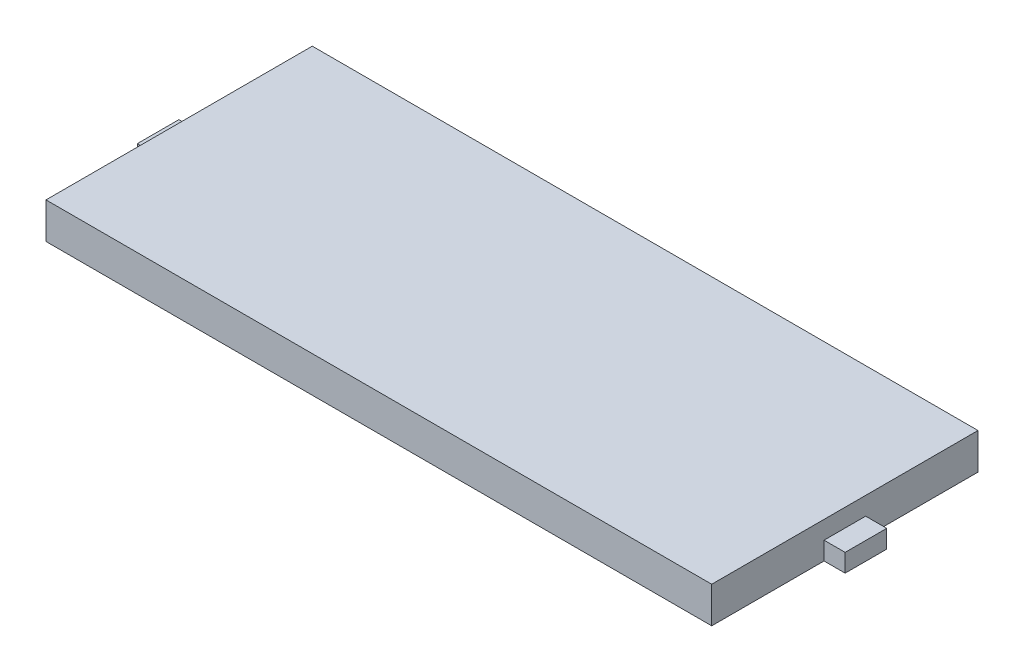
ISO-10303-21;
HEADER;
FILE_DESCRIPTION(('STEP AP214'),'2;1');
FILE_NAME('part.step','',(''),(''),'','','');
FILE_SCHEMA(('AUTOMOTIVE_DESIGN { 1 0 10303 214 1 1 1 1 }'));
ENDSEC;
DATA;
#1=APPLICATION_CONTEXT('core data for automotive mechanical design processes');
#2=APPLICATION_PROTOCOL_DEFINITION('international standard','automotive_design',2000,#1);
#3=PRODUCT_CONTEXT('',#1,'mechanical');
#4=PRODUCT('Part','Part','',(#3));
#5=PRODUCT_RELATED_PRODUCT_CATEGORY('part','',(#4));
#6=PRODUCT_DEFINITION_FORMATION('','',#4);
#7=PRODUCT_DEFINITION_CONTEXT('part definition',#1,'design');
#8=PRODUCT_DEFINITION('design','',#6,#7);
#9=PRODUCT_DEFINITION_SHAPE('','',#8);
#10=(LENGTH_UNIT() NAMED_UNIT(*) SI_UNIT(.MILLI.,.METRE.));
#11=(NAMED_UNIT(*) PLANE_ANGLE_UNIT() SI_UNIT($,.RADIAN.));
#12=(NAMED_UNIT(*) SI_UNIT($,.STERADIAN.) SOLID_ANGLE_UNIT());
#13=UNCERTAINTY_MEASURE_WITH_UNIT(LENGTH_MEASURE(1.E-05),#10,'distance_accuracy_value','');
#14=(GEOMETRIC_REPRESENTATION_CONTEXT(3) GLOBAL_UNCERTAINTY_ASSIGNED_CONTEXT((#13)) GLOBAL_UNIT_ASSIGNED_CONTEXT((#10,
#11,#12)) REPRESENTATION_CONTEXT('',''));
#15=CARTESIAN_POINT('',(0.,0.,0.));
#16=DIRECTION('',(0.,0.,1.));
#17=DIRECTION('',(1.,0.,0.));
#18=AXIS2_PLACEMENT_3D('',#15,#16,#17);
#19=CARTESIAN_POINT('',(6.38,0.325,-0.375));
#20=DIRECTION('',(-1.,0.,0.));
#21=DIRECTION('',(0.,0.,-1.));
#22=AXIS2_PLACEMENT_3D('',#19,#20,#21);
#23=PLANE('',#22);
#24=DIRECTION('',(0.,0.,1.));
#25=VECTOR('',#24,1.);
#26=CARTESIAN_POINT('',(6.38,0.,-0.375));
#27=LINE('',#26,#25);
#28=CARTESIAN_POINT('',(6.38,0.,-0.375));
#29=VERTEX_POINT('',#28);
#30=CARTESIAN_POINT('',(6.38,0.,0.375));
#31=VERTEX_POINT('',#30);
#32=EDGE_CURVE('E113',#29,#31,#27,.T.);
#33=ORIENTED_EDGE('',*,*,#32,.F.);
#34=DIRECTION('',(0.,-1.,0.));
#35=VECTOR('',#34,1.);
#36=CARTESIAN_POINT('',(6.38,0.325,-0.375));
#37=LINE('',#36,#35);
#38=CARTESIAN_POINT('',(6.38,0.325,-0.375));
#39=VERTEX_POINT('',#38);
#40=EDGE_CURVE('E112',#39,#29,#37,.T.);
#41=ORIENTED_EDGE('',*,*,#40,.F.);
#42=DIRECTION('',(0.,0.,1.));
#43=VECTOR('',#42,1.);
#44=CARTESIAN_POINT('',(6.38,0.325,-0.375));
#45=LINE('',#44,#43);
#46=CARTESIAN_POINT('',(6.38,0.325,0.375));
#47=VERTEX_POINT('',#46);
#48=EDGE_CURVE('E107',#39,#47,#45,.T.);
#49=ORIENTED_EDGE('',*,*,#48,.T.);
#50=DIRECTION('',(0.,-1.,0.));
#51=VECTOR('',#50,1.);
#52=CARTESIAN_POINT('',(6.38,0.325,0.375));
#53=LINE('',#52,#51);
#54=EDGE_CURVE('E12',#47,#31,#53,.T.);
#55=ORIENTED_EDGE('',*,*,#54,.T.);
#56=EDGE_LOOP('',(#33,#41,#49,#55));
#57=FACE_BOUND('',#56,.T.);
#58=ADVANCED_FACE('F50',(#57),#23,.F.);
#59=CARTESIAN_POINT('',(0.619999999999997,0.325,0.375));
#60=DIRECTION('',(0.,0.,-1.));
#61=DIRECTION('',(1.,0.,0.));
#62=AXIS2_PLACEMENT_3D('',#59,#60,#61);
#63=PLANE('',#62);
#64=DIRECTION('',(-1.,0.,0.));
#65=VECTOR('',#64,1.);
#66=CARTESIAN_POINT('',(0.619999999999997,0.,0.375));
#67=LINE('',#66,#65);
#68=CARTESIAN_POINT('',(0.619999999999997,0.,0.375));
#69=VERTEX_POINT('',#68);
#70=EDGE_CURVE('E115',#31,#69,#67,.T.);
#71=ORIENTED_EDGE('',*,*,#70,.F.);
#72=ORIENTED_EDGE('',*,*,#54,.F.);
#73=DIRECTION('',(-1.,0.,0.));
#74=VECTOR('',#73,1.);
#75=CARTESIAN_POINT('',(0.619999999999997,0.325,0.375));
#76=LINE('',#75,#74);
#77=CARTESIAN_POINT('',(0.619999999999997,0.325,0.375));
#78=VERTEX_POINT('',#77);
#79=EDGE_CURVE('E91',#47,#78,#76,.T.);
#80=ORIENTED_EDGE('',*,*,#79,.T.);
#81=DIRECTION('',(0.,-1.,0.));
#82=VECTOR('',#81,1.);
#83=CARTESIAN_POINT('',(0.619999999999997,0.325,0.375));
#84=LINE('',#83,#82);
#85=EDGE_CURVE('E58',#78,#69,#84,.T.);
#86=ORIENTED_EDGE('',*,*,#85,.T.);
#87=EDGE_LOOP('',(#71,#72,#80,#86));
#88=FACE_BOUND('',#87,.T.);
#89=ADVANCED_FACE('F105',(#88),#63,.F.);
#90=CARTESIAN_POINT('',(0.619999999999997,0.325,-0.375));
#91=DIRECTION('',(1.,0.,0.));
#92=DIRECTION('',(0.,0.,1.));
#93=AXIS2_PLACEMENT_3D('',#90,#91,#92);
#94=PLANE('',#93);
#95=DIRECTION('',(0.,0.,-1.));
#96=VECTOR('',#95,1.);
#97=CARTESIAN_POINT('',(0.619999999999997,0.,-0.375));
#98=LINE('',#97,#96);
#99=CARTESIAN_POINT('',(0.619999999999997,0.,-0.375));
#100=VERTEX_POINT('',#99);
#101=EDGE_CURVE('E101',#69,#100,#98,.T.);
#102=ORIENTED_EDGE('',*,*,#101,.F.);
#103=ORIENTED_EDGE('',*,*,#85,.F.);
#104=DIRECTION('',(0.,0.,-1.));
#105=VECTOR('',#104,1.);
#106=CARTESIAN_POINT('',(0.619999999999997,0.325,-0.375));
#107=LINE('',#106,#105);
#108=CARTESIAN_POINT('',(0.619999999999997,0.325,-0.375));
#109=VERTEX_POINT('',#108);
#110=EDGE_CURVE('E94',#78,#109,#107,.T.);
#111=ORIENTED_EDGE('',*,*,#110,.T.);
#112=DIRECTION('',(0.,-1.,0.));
#113=VECTOR('',#112,1.);
#114=CARTESIAN_POINT('',(0.619999999999997,0.325,-0.375));
#115=LINE('',#114,#113);
#116=EDGE_CURVE('E104',#109,#100,#115,.T.);
#117=ORIENTED_EDGE('',*,*,#116,.T.);
#118=EDGE_LOOP('',(#102,#103,#111,#117));
#119=FACE_BOUND('',#118,.T.);
#120=ADVANCED_FACE('F100',(#119),#94,.F.);
#121=CARTESIAN_POINT('',(0.619999999999997,0.325,-0.375));
#122=DIRECTION('',(0.,0.,1.));
#123=DIRECTION('',(-1.,0.,0.));
#124=AXIS2_PLACEMENT_3D('',#121,#122,#123);
#125=PLANE('',#124);
#126=DIRECTION('',(1.,0.,0.));
#127=VECTOR('',#126,1.);
#128=CARTESIAN_POINT('',(0.619999999999997,0.,-0.375));
#129=LINE('',#128,#127);
#130=EDGE_CURVE('E80',#100,#29,#129,.T.);
#131=ORIENTED_EDGE('',*,*,#130,.F.);
#132=ORIENTED_EDGE('',*,*,#116,.F.);
#133=DIRECTION('',(1.,0.,0.));
#134=VECTOR('',#133,1.);
#135=CARTESIAN_POINT('',(0.619999999999997,0.325,-0.375));
#136=LINE('',#135,#134);
#137=EDGE_CURVE('E66',#109,#39,#136,.T.);
#138=ORIENTED_EDGE('',*,*,#137,.T.);
#139=ORIENTED_EDGE('',*,*,#40,.T.);
#140=EDGE_LOOP('',(#131,#132,#138,#139));
#141=FACE_BOUND('',#140,.T.);
#142=ADVANCED_FACE('F124',(#141),#125,.F.);
#143=CARTESIAN_POINT('',(0.,0.325,0.));
#144=DIRECTION('',(0.,-1.,0.));
#145=DIRECTION('',(0.,0.,-1.));
#146=AXIS2_PLACEMENT_3D('',#143,#144,#145);
#147=PLANE('',#146);
#148=ORIENTED_EDGE('',*,*,#48,.F.);
#149=ORIENTED_EDGE('',*,*,#137,.F.);
#150=ORIENTED_EDGE('',*,*,#110,.F.);
#151=ORIENTED_EDGE('',*,*,#79,.F.);
#152=EDGE_LOOP('',(#148,#149,#150,#151));
#153=FACE_BOUND('',#152,.T.);
#154=ADVANCED_FACE('F96',(#153),#147,.F.);
#155=CARTESIAN_POINT('',(0.,0.,0.));
#156=DIRECTION('',(0.,-1.,0.));
#157=DIRECTION('',(0.,0.,-1.));
#158=AXIS2_PLACEMENT_3D('',#155,#156,#157);
#159=PLANE('',#158);
#160=ORIENTED_EDGE('',*,*,#32,.T.);
#161=ORIENTED_EDGE('',*,*,#70,.T.);
#162=ORIENTED_EDGE('',*,*,#101,.T.);
#163=ORIENTED_EDGE('',*,*,#130,.T.);
#164=EDGE_LOOP('',(#160,#161,#162,#163));
#165=FACE_BOUND('',#164,.T.);
#166=ADVANCED_FACE('F120',(#165),#159,.T.);
#167=CLOSED_SHELL('',(#58,#89,#120,#142,#154,#166));
#168=MANIFOLD_SOLID_BREP('B2',#167);
#169=CARTESIAN_POINT('',(-6.38,0.325,-0.375));
#170=DIRECTION('',(1.,0.,0.));
#171=DIRECTION('',(0.,0.,-1.));
#172=AXIS2_PLACEMENT_3D('',#169,#170,#171);
#173=PLANE('',#172);
#174=DIRECTION('',(0.,0.,1.));
#175=VECTOR('',#174,1.);
#176=CARTESIAN_POINT('',(-6.38,0.,-0.375));
#177=LINE('',#176,#175);
#178=CARTESIAN_POINT('',(-6.38,0.,-0.375));
#179=VERTEX_POINT('',#178);
#180=CARTESIAN_POINT('',(-6.38,0.,0.375));
#181=VERTEX_POINT('',#180);
#182=EDGE_CURVE('E246',#179,#181,#177,.T.);
#183=ORIENTED_EDGE('',*,*,#182,.T.);
#184=DIRECTION('',(0.,-1.,0.));
#185=VECTOR('',#184,1.);
#186=CARTESIAN_POINT('',(-6.38,0.325,0.375));
#187=LINE('',#186,#185);
#188=CARTESIAN_POINT('',(-6.38,0.325,0.375));
#189=VERTEX_POINT('',#188);
#190=EDGE_CURVE('E48',#189,#181,#187,.T.);
#191=ORIENTED_EDGE('',*,*,#190,.F.);
#192=DIRECTION('',(0.,0.,1.));
#193=VECTOR('',#192,1.);
#194=CARTESIAN_POINT('',(-6.38,0.325,-0.375));
#195=LINE('',#194,#193);
#196=CARTESIAN_POINT('',(-6.38,0.325,-0.375));
#197=VERTEX_POINT('',#196);
#198=EDGE_CURVE('E234',#197,#189,#195,.T.);
#199=ORIENTED_EDGE('',*,*,#198,.F.);
#200=DIRECTION('',(0.,-1.,0.));
#201=VECTOR('',#200,1.);
#202=CARTESIAN_POINT('',(-6.38,0.325,-0.375));
#203=LINE('',#202,#201);
#204=EDGE_CURVE('E242',#197,#179,#203,.T.);
#205=ORIENTED_EDGE('',*,*,#204,.T.);
#206=EDGE_LOOP('',(#183,#191,#199,#205));
#207=FACE_BOUND('',#206,.T.);
#208=ADVANCED_FACE('F183',(#207),#173,.F.);
#209=CARTESIAN_POINT('',(-0.619999999999997,0.325,0.375));
#210=DIRECTION('',(0.,0.,-1.));
#211=DIRECTION('',(-1.,0.,0.));
#212=AXIS2_PLACEMENT_3D('',#209,#210,#211);
#213=PLANE('',#212);
#214=DIRECTION('',(1.,0.,0.));
#215=VECTOR('',#214,1.);
#216=CARTESIAN_POINT('',(-0.619999999999997,0.,0.375));
#217=LINE('',#216,#215);
#218=CARTESIAN_POINT('',(-0.619999999999997,0.,0.375));
#219=VERTEX_POINT('',#218);
#220=EDGE_CURVE('E238',#181,#219,#217,.T.);
#221=ORIENTED_EDGE('',*,*,#220,.T.);
#222=DIRECTION('',(0.,-1.,0.));
#223=VECTOR('',#222,1.);
#224=CARTESIAN_POINT('',(-0.619999999999997,0.325,0.375));
#225=LINE('',#224,#223);
#226=CARTESIAN_POINT('',(-0.619999999999997,0.325,0.375));
#227=VERTEX_POINT('',#226);
#228=EDGE_CURVE('E191',#227,#219,#225,.T.);
#229=ORIENTED_EDGE('',*,*,#228,.F.);
#230=DIRECTION('',(1.,0.,0.));
#231=VECTOR('',#230,1.);
#232=CARTESIAN_POINT('',(-0.619999999999997,0.325,0.375));
#233=LINE('',#232,#231);
#234=EDGE_CURVE('E229',#189,#227,#233,.T.);
#235=ORIENTED_EDGE('',*,*,#234,.F.);
#236=ORIENTED_EDGE('',*,*,#190,.T.);
#237=EDGE_LOOP('',(#221,#229,#235,#236));
#238=FACE_BOUND('',#237,.T.);
#239=ADVANCED_FACE('F237',(#238),#213,.F.);
#240=CARTESIAN_POINT('',(-0.619999999999997,0.325,-0.375));
#241=DIRECTION('',(-1.,0.,0.));
#242=DIRECTION('',(0.,0.,1.));
#243=AXIS2_PLACEMENT_3D('',#240,#241,#242);
#244=PLANE('',#243);
#245=DIRECTION('',(0.,0.,-1.));
#246=VECTOR('',#245,1.);
#247=CARTESIAN_POINT('',(-0.619999999999997,0.,-0.375));
#248=LINE('',#247,#246);
#249=CARTESIAN_POINT('',(-0.619999999999997,0.,-0.375));
#250=VERTEX_POINT('',#249);
#251=EDGE_CURVE('E216',#219,#250,#248,.T.);
#252=ORIENTED_EDGE('',*,*,#251,.T.);
#253=DIRECTION('',(0.,-1.,0.));
#254=VECTOR('',#253,1.);
#255=CARTESIAN_POINT('',(-0.619999999999997,0.325,-0.375));
#256=LINE('',#255,#254);
#257=CARTESIAN_POINT('',(-0.619999999999997,0.325,-0.375));
#258=VERTEX_POINT('',#257);
#259=EDGE_CURVE('E239',#258,#250,#256,.T.);
#260=ORIENTED_EDGE('',*,*,#259,.F.);
#261=DIRECTION('',(0.,0.,-1.));
#262=VECTOR('',#261,1.);
#263=CARTESIAN_POINT('',(-0.619999999999997,0.325,-0.375));
#264=LINE('',#263,#262);
#265=EDGE_CURVE('E232',#227,#258,#264,.T.);
#266=ORIENTED_EDGE('',*,*,#265,.F.);
#267=ORIENTED_EDGE('',*,*,#228,.T.);
#268=EDGE_LOOP('',(#252,#260,#266,#267));
#269=FACE_BOUND('',#268,.T.);
#270=ADVANCED_FACE('F240',(#269),#244,.F.);
#271=CARTESIAN_POINT('',(-0.619999999999997,0.325,-0.375));
#272=DIRECTION('',(0.,0.,1.));
#273=DIRECTION('',(1.,0.,0.));
#274=AXIS2_PLACEMENT_3D('',#271,#272,#273);
#275=PLANE('',#274);
#276=DIRECTION('',(-1.,0.,0.));
#277=VECTOR('',#276,1.);
#278=CARTESIAN_POINT('',(-0.619999999999997,0.,-0.375));
#279=LINE('',#278,#277);
#280=EDGE_CURVE('E222',#250,#179,#279,.T.);
#281=ORIENTED_EDGE('',*,*,#280,.T.);
#282=ORIENTED_EDGE('',*,*,#204,.F.);
#283=DIRECTION('',(-1.,0.,0.));
#284=VECTOR('',#283,1.);
#285=CARTESIAN_POINT('',(-0.619999999999997,0.325,-0.375));
#286=LINE('',#285,#284);
#287=EDGE_CURVE('E199',#258,#197,#286,.T.);
#288=ORIENTED_EDGE('',*,*,#287,.F.);
#289=ORIENTED_EDGE('',*,*,#259,.T.);
#290=EDGE_LOOP('',(#281,#282,#288,#289));
#291=FACE_BOUND('',#290,.T.);
#292=ADVANCED_FACE('F253',(#291),#275,.F.);
#293=CARTESIAN_POINT('',(0.,0.325,0.));
#294=DIRECTION('',(0.,-1.,0.));
#295=DIRECTION('',(0.,0.,-1.));
#296=AXIS2_PLACEMENT_3D('',#293,#294,#295);
#297=PLANE('',#296);
#298=ORIENTED_EDGE('',*,*,#198,.T.);
#299=ORIENTED_EDGE('',*,*,#234,.T.);
#300=ORIENTED_EDGE('',*,*,#265,.T.);
#301=ORIENTED_EDGE('',*,*,#287,.T.);
#302=EDGE_LOOP('',(#298,#299,#300,#301));
#303=FACE_BOUND('',#302,.T.);
#304=ADVANCED_FACE('F230',(#303),#297,.F.);
#305=CARTESIAN_POINT('',(0.,0.,0.));
#306=DIRECTION('',(0.,-1.,0.));
#307=DIRECTION('',(0.,0.,-1.));
#308=AXIS2_PLACEMENT_3D('',#305,#306,#307);
#309=PLANE('',#308);
#310=ORIENTED_EDGE('',*,*,#182,.F.);
#311=ORIENTED_EDGE('',*,*,#280,.F.);
#312=ORIENTED_EDGE('',*,*,#251,.F.);
#313=ORIENTED_EDGE('',*,*,#220,.F.);
#314=EDGE_LOOP('',(#310,#311,#312,#313));
#315=FACE_BOUND('',#314,.T.);
#316=ADVANCED_FACE('F256',(#315),#309,.T.);
#317=CLOSED_SHELL('',(#208,#239,#270,#292,#304,#316));
#318=MANIFOLD_SOLID_BREP('B6',#317);
#319=CARTESIAN_POINT('',(-6.,0.65,2.4));
#320=DIRECTION('',(1.,0.,0.));
#321=DIRECTION('',(0.,0.,-1.));
#322=AXIS2_PLACEMENT_3D('',#319,#320,#321);
#323=PLANE('',#322);
#324=DIRECTION('',(0.,1.,0.));
#325=VECTOR('',#324,1.);
#326=CARTESIAN_POINT('',(-6.,0.65,0.375));
#327=LINE('',#326,#325);
#328=CARTESIAN_POINT('',(-6.,0.,0.375));
#329=VERTEX_POINT('',#328);
#330=CARTESIAN_POINT('',(-6.,0.325,0.375));
#331=VERTEX_POINT('',#330);
#332=EDGE_CURVE('E458',#329,#331,#327,.T.);
#333=ORIENTED_EDGE('',*,*,#332,.F.);
#334=DIRECTION('',(0.,0.,1.));
#335=VECTOR('',#334,1.);
#336=CARTESIAN_POINT('',(-6.,0.,2.4));
#337=LINE('',#336,#335);
#338=CARTESIAN_POINT('',(-6.,0.,2.4));
#339=VERTEX_POINT('',#338);
#340=EDGE_CURVE('E484',#329,#339,#337,.T.);
#341=ORIENTED_EDGE('',*,*,#340,.T.);
#342=DIRECTION('',(0.,-1.,0.));
#343=VECTOR('',#342,1.);
#344=CARTESIAN_POINT('',(-6.,0.65,2.4));
#345=LINE('',#344,#343);
#346=CARTESIAN_POINT('',(-6.,0.65,2.4));
#347=VERTEX_POINT('',#346);
#348=EDGE_CURVE('E494',#347,#339,#345,.T.);
#349=ORIENTED_EDGE('',*,*,#348,.F.);
#350=DIRECTION('',(0.,0.,1.));
#351=VECTOR('',#350,1.);
#352=CARTESIAN_POINT('',(-6.,0.65,2.4));
#353=LINE('',#352,#351);
#354=CARTESIAN_POINT('',(-6.,0.65,-2.4));
#355=VERTEX_POINT('',#354);
#356=EDGE_CURVE('E470',#355,#347,#353,.T.);
#357=ORIENTED_EDGE('',*,*,#356,.F.);
#358=DIRECTION('',(0.,-1.,0.));
#359=VECTOR('',#358,1.);
#360=CARTESIAN_POINT('',(-6.,0.65,-2.4));
#361=LINE('',#360,#359);
#362=CARTESIAN_POINT('',(-6.,0.,-2.4));
#363=VERTEX_POINT('',#362);
#364=EDGE_CURVE('E498',#355,#363,#361,.T.);
#365=ORIENTED_EDGE('',*,*,#364,.T.);
#366=CARTESIAN_POINT('',(-6.,0.,-0.375));
#367=VERTEX_POINT('',#366);
#368=EDGE_CURVE('E485',#363,#367,#337,.T.);
#369=ORIENTED_EDGE('',*,*,#368,.T.);
#370=DIRECTION('',(0.,-1.,0.));
#371=VECTOR('',#370,1.);
#372=CARTESIAN_POINT('',(-6.,0.65,-0.375));
#373=LINE('',#372,#371);
#374=CARTESIAN_POINT('',(-6.,0.325,-0.375));
#375=VERTEX_POINT('',#374);
#376=EDGE_CURVE('E331',#375,#367,#373,.T.);
#377=ORIENTED_EDGE('',*,*,#376,.F.);
#378=DIRECTION('',(0.,0.,-1.));
#379=VECTOR('',#378,1.);
#380=CARTESIAN_POINT('',(-6.,0.325,2.4));
#381=LINE('',#380,#379);
#382=EDGE_CURVE('E510',#331,#375,#381,.T.);
#383=ORIENTED_EDGE('',*,*,#382,.F.);
#384=EDGE_LOOP('',(#333,#341,#349,#357,#365,#369,#377,#383));
#385=FACE_BOUND('',#384,.T.);
#386=ADVANCED_FACE('F307',(#385),#323,.F.);
#387=CARTESIAN_POINT('',(0.,0.,0.));
#388=DIRECTION('',(0.,-1.,0.));
#389=DIRECTION('',(0.,0.,-1.));
#390=AXIS2_PLACEMENT_3D('',#387,#388,#389);
#391=PLANE('',#390);
#392=DIRECTION('',(1.,0.,0.));
#393=VECTOR('',#392,1.);
#394=CARTESIAN_POINT('',(0.619999999999997,0.,-0.375));
#395=LINE('',#394,#393);
#396=CARTESIAN_POINT('',(0.619999999999997,0.,-0.375));
#397=VERTEX_POINT('',#396);
#398=CARTESIAN_POINT('',(6.,0.,-0.375));
#399=VERTEX_POINT('',#398);
#400=EDGE_CURVE('E426',#397,#399,#395,.T.);
#401=ORIENTED_EDGE('',*,*,#400,.F.);
#402=DIRECTION('',(0.,0.,-1.));
#403=VECTOR('',#402,1.);
#404=CARTESIAN_POINT('',(0.619999999999997,0.,-0.375));
#405=LINE('',#404,#403);
#406=CARTESIAN_POINT('',(0.619999999999997,0.,0.375));
#407=VERTEX_POINT('',#406);
#408=EDGE_CURVE('E405',#407,#397,#405,.T.);
#409=ORIENTED_EDGE('',*,*,#408,.F.);
#410=DIRECTION('',(-1.,0.,0.));
#411=VECTOR('',#410,1.);
#412=CARTESIAN_POINT('',(0.619999999999997,0.,0.375));
#413=LINE('',#412,#411);
#414=CARTESIAN_POINT('',(6.,0.,0.375));
#415=VERTEX_POINT('',#414);
#416=EDGE_CURVE('E415',#415,#407,#413,.T.);
#417=ORIENTED_EDGE('',*,*,#416,.F.);
#418=DIRECTION('',(0.,0.,-1.));
#419=VECTOR('',#418,1.);
#420=CARTESIAN_POINT('',(6.,0.,2.4));
#421=LINE('',#420,#419);
#422=CARTESIAN_POINT('',(6.,0.,2.4));
#423=VERTEX_POINT('',#422);
#424=EDGE_CURVE('E477',#423,#415,#421,.T.);
#425=ORIENTED_EDGE('',*,*,#424,.F.);
#426=DIRECTION('',(1.,0.,0.));
#427=VECTOR('',#426,1.);
#428=CARTESIAN_POINT('',(-6.,0.,2.4));
#429=LINE('',#428,#427);
#430=EDGE_CURVE('E467',#339,#423,#429,.T.);
#431=ORIENTED_EDGE('',*,*,#430,.F.);
#432=ORIENTED_EDGE('',*,*,#340,.F.);
#433=DIRECTION('',(1.,0.,0.));
#434=VECTOR('',#433,1.);
#435=CARTESIAN_POINT('',(0.,0.,0.375));
#436=LINE('',#435,#434);
#437=CARTESIAN_POINT('',(-0.619999999999997,0.,0.375));
#438=VERTEX_POINT('',#437);
#439=EDGE_CURVE('E506',#329,#438,#436,.T.);
#440=ORIENTED_EDGE('',*,*,#439,.T.);
#441=DIRECTION('',(0.,0.,-1.));
#442=VECTOR('',#441,1.);
#443=CARTESIAN_POINT('',(-0.619999999999997,0.,-0.375));
#444=LINE('',#443,#442);
#445=CARTESIAN_POINT('',(-0.619999999999997,0.,-0.375));
#446=VERTEX_POINT('',#445);
#447=EDGE_CURVE('E409',#438,#446,#444,.T.);
#448=ORIENTED_EDGE('',*,*,#447,.T.);
#449=DIRECTION('',(-1.,0.,0.));
#450=VECTOR('',#449,1.);
#451=CARTESIAN_POINT('',(-0.619999999999997,0.,-0.375));
#452=LINE('',#451,#450);
#453=EDGE_CURVE('E439',#446,#367,#452,.T.);
#454=ORIENTED_EDGE('',*,*,#453,.T.);
#455=ORIENTED_EDGE('',*,*,#368,.F.);
#456=DIRECTION('',(-1.,0.,0.));
#457=VECTOR('',#456,1.);
#458=CARTESIAN_POINT('',(-6.,0.,-2.4));
#459=LINE('',#458,#457);
#460=CARTESIAN_POINT('',(6.,0.,-2.4));
#461=VERTEX_POINT('',#460);
#462=EDGE_CURVE('E481',#461,#363,#459,.T.);
#463=ORIENTED_EDGE('',*,*,#462,.F.);
#464=EDGE_CURVE('E461',#399,#461,#421,.T.);
#465=ORIENTED_EDGE('',*,*,#464,.F.);
#466=EDGE_LOOP('',(#401,#409,#417,#425,#431,#432,#440,#448,#454,#455,#463,#465));
#467=FACE_BOUND('',#466,.T.);
#468=ADVANCED_FACE('F523',(#467),#391,.T.);
#469=CARTESIAN_POINT('',(6.,0.65,2.4));
#470=DIRECTION('',(-1.,0.,0.));
#471=DIRECTION('',(0.,0.,1.));
#472=AXIS2_PLACEMENT_3D('',#469,#470,#471);
#473=PLANE('',#472);
#474=DIRECTION('',(0.,0.,1.));
#475=VECTOR('',#474,1.);
#476=CARTESIAN_POINT('',(6.,0.325,2.4));
#477=LINE('',#476,#475);
#478=CARTESIAN_POINT('',(6.,0.325,-0.375));
#479=VERTEX_POINT('',#478);
#480=CARTESIAN_POINT('',(6.,0.325,0.375));
#481=VERTEX_POINT('',#480);
#482=EDGE_CURVE('E513',#479,#481,#477,.T.);
#483=ORIENTED_EDGE('',*,*,#482,.F.);
#484=DIRECTION('',(0.,-1.,0.));
#485=VECTOR('',#484,1.);
#486=CARTESIAN_POINT('',(6.,0.65,-0.375));
#487=LINE('',#486,#485);
#488=EDGE_CURVE('E181',#479,#399,#487,.T.);
#489=ORIENTED_EDGE('',*,*,#488,.T.);
#490=ORIENTED_EDGE('',*,*,#464,.T.);
#491=DIRECTION('',(0.,-1.,0.));
#492=VECTOR('',#491,1.);
#493=CARTESIAN_POINT('',(6.,0.65,-2.4));
#494=LINE('',#493,#492);
#495=CARTESIAN_POINT('',(6.,0.65,-2.4));
#496=VERTEX_POINT('',#495);
#497=EDGE_CURVE('E502',#496,#461,#494,.T.);
#498=ORIENTED_EDGE('',*,*,#497,.F.);
#499=DIRECTION('',(0.,0.,-1.));
#500=VECTOR('',#499,1.);
#501=CARTESIAN_POINT('',(6.,0.65,2.4));
#502=LINE('',#501,#500);
#503=CARTESIAN_POINT('',(6.,0.65,2.4));
#504=VERTEX_POINT('',#503);
#505=EDGE_CURVE('E462',#504,#496,#502,.T.);
#506=ORIENTED_EDGE('',*,*,#505,.F.);
#507=DIRECTION('',(0.,-1.,0.));
#508=VECTOR('',#507,1.);
#509=CARTESIAN_POINT('',(6.,0.65,2.4));
#510=LINE('',#509,#508);
#511=EDGE_CURVE('E476',#504,#423,#510,.T.);
#512=ORIENTED_EDGE('',*,*,#511,.T.);
#513=ORIENTED_EDGE('',*,*,#424,.T.);
#514=DIRECTION('',(0.,1.,0.));
#515=VECTOR('',#514,1.);
#516=CARTESIAN_POINT('',(6.,0.65,0.375));
#517=LINE('',#516,#515);
#518=EDGE_CURVE('E316',#415,#481,#517,.T.);
#519=ORIENTED_EDGE('',*,*,#518,.T.);
#520=EDGE_LOOP('',(#483,#489,#490,#498,#506,#512,#513,#519));
#521=FACE_BOUND('',#520,.T.);
#522=ADVANCED_FACE('F309',(#521),#473,.F.);
#523=CARTESIAN_POINT('',(-6.,0.65,-2.4));
#524=DIRECTION('',(0.,0.,1.));
#525=DIRECTION('',(1.,0.,0.));
#526=AXIS2_PLACEMENT_3D('',#523,#524,#525);
#527=PLANE('',#526);
#528=ORIENTED_EDGE('',*,*,#462,.T.);
#529=ORIENTED_EDGE('',*,*,#364,.F.);
#530=DIRECTION('',(-1.,0.,0.));
#531=VECTOR('',#530,1.);
#532=CARTESIAN_POINT('',(-6.,0.65,-2.4));
#533=LINE('',#532,#531);
#534=EDGE_CURVE('E466',#496,#355,#533,.T.);
#535=ORIENTED_EDGE('',*,*,#534,.F.);
#536=ORIENTED_EDGE('',*,*,#497,.T.);
#537=EDGE_LOOP('',(#528,#529,#535,#536));
#538=FACE_BOUND('',#537,.T.);
#539=ADVANCED_FACE('F533',(#538),#527,.F.);
#540=CARTESIAN_POINT('',(-6.,0.65,2.4));
#541=DIRECTION('',(0.,0.,-1.));
#542=DIRECTION('',(-1.,0.,0.));
#543=AXIS2_PLACEMENT_3D('',#540,#541,#542);
#544=PLANE('',#543);
#545=ORIENTED_EDGE('',*,*,#430,.T.);
#546=ORIENTED_EDGE('',*,*,#511,.F.);
#547=DIRECTION('',(1.,0.,0.));
#548=VECTOR('',#547,1.);
#549=CARTESIAN_POINT('',(-6.,0.65,2.4));
#550=LINE('',#549,#548);
#551=EDGE_CURVE('E473',#347,#504,#550,.T.);
#552=ORIENTED_EDGE('',*,*,#551,.F.);
#553=ORIENTED_EDGE('',*,*,#348,.T.);
#554=EDGE_LOOP('',(#545,#546,#552,#553));
#555=FACE_BOUND('',#554,.T.);
#556=ADVANCED_FACE('F540',(#555),#544,.F.);
#557=CARTESIAN_POINT('',(0.,0.65,0.));
#558=DIRECTION('',(0.,-1.,0.));
#559=DIRECTION('',(0.,0.,-1.));
#560=AXIS2_PLACEMENT_3D('',#557,#558,#559);
#561=PLANE('',#560);
#562=ORIENTED_EDGE('',*,*,#505,.T.);
#563=ORIENTED_EDGE('',*,*,#534,.T.);
#564=ORIENTED_EDGE('',*,*,#356,.T.);
#565=ORIENTED_EDGE('',*,*,#551,.T.);
#566=EDGE_LOOP('',(#562,#563,#564,#565));
#567=FACE_BOUND('',#566,.T.);
#568=ADVANCED_FACE('F536',(#567),#561,.F.);
#569=CARTESIAN_POINT('',(0.,0.325,0.));
#570=DIRECTION('',(0.,-1.,0.));
#571=DIRECTION('',(0.,0.,-1.));
#572=AXIS2_PLACEMENT_3D('',#569,#570,#571);
#573=PLANE('',#572);
#574=ORIENTED_EDGE('',*,*,#382,.T.);
#575=DIRECTION('',(-1.,0.,0.));
#576=VECTOR('',#575,1.);
#577=CARTESIAN_POINT('',(-0.619999999999997,0.325,-0.375));
#578=LINE('',#577,#576);
#579=CARTESIAN_POINT('',(-0.619999999999997,0.325,-0.375));
#580=VERTEX_POINT('',#579);
#581=EDGE_CURVE('E442',#580,#375,#578,.T.);
#582=ORIENTED_EDGE('',*,*,#581,.F.);
#583=DIRECTION('',(0.,0.,-1.));
#584=VECTOR('',#583,1.);
#585=CARTESIAN_POINT('',(-0.619999999999997,0.325,-0.375));
#586=LINE('',#585,#584);
#587=CARTESIAN_POINT('',(-0.619999999999997,0.325,0.375));
#588=VERTEX_POINT('',#587);
#589=EDGE_CURVE('E438',#588,#580,#586,.T.);
#590=ORIENTED_EDGE('',*,*,#589,.F.);
#591=DIRECTION('',(1.,0.,0.));
#592=VECTOR('',#591,1.);
#593=CARTESIAN_POINT('',(-0.619999999999997,0.325,0.375));
#594=LINE('',#593,#592);
#595=EDGE_CURVE('E435',#331,#588,#594,.T.);
#596=ORIENTED_EDGE('',*,*,#595,.F.);
#597=EDGE_LOOP('',(#574,#582,#590,#596));
#598=FACE_BOUND('',#597,.T.);
#599=ADVANCED_FACE('F553',(#598),#573,.T.);
#600=CARTESIAN_POINT('',(-0.619999999999997,0.325,0.375));
#601=DIRECTION('',(0.,0.,-1.));
#602=DIRECTION('',(-1.,0.,0.));
#603=AXIS2_PLACEMENT_3D('',#600,#601,#602);
#604=PLANE('',#603);
#605=ORIENTED_EDGE('',*,*,#332,.T.);
#606=ORIENTED_EDGE('',*,*,#595,.T.);
#607=DIRECTION('',(0.,-1.,0.));
#608=VECTOR('',#607,1.);
#609=CARTESIAN_POINT('',(-0.619999999999997,0.325,0.375));
#610=LINE('',#609,#608);
#611=EDGE_CURVE('E453',#588,#438,#610,.T.);
#612=ORIENTED_EDGE('',*,*,#611,.T.);
#613=ORIENTED_EDGE('',*,*,#439,.F.);
#614=EDGE_LOOP('',(#605,#606,#612,#613));
#615=FACE_BOUND('',#614,.T.);
#616=ADVANCED_FACE('F549',(#615),#604,.T.);
#617=CARTESIAN_POINT('',(-0.619999999999997,0.325,-0.375));
#618=DIRECTION('',(0.,0.,1.));
#619=DIRECTION('',(1.,0.,0.));
#620=AXIS2_PLACEMENT_3D('',#617,#618,#619);
#621=PLANE('',#620);
#622=ORIENTED_EDGE('',*,*,#376,.T.);
#623=ORIENTED_EDGE('',*,*,#453,.F.);
#624=DIRECTION('',(0.,-1.,0.));
#625=VECTOR('',#624,1.);
#626=CARTESIAN_POINT('',(-0.619999999999997,0.325,-0.375));
#627=LINE('',#626,#625);
#628=EDGE_CURVE('E445',#580,#446,#627,.T.);
#629=ORIENTED_EDGE('',*,*,#628,.F.);
#630=ORIENTED_EDGE('',*,*,#581,.T.);
#631=EDGE_LOOP('',(#622,#623,#629,#630));
#632=FACE_BOUND('',#631,.T.);
#633=ADVANCED_FACE('F559',(#632),#621,.T.);
#634=CARTESIAN_POINT('',(-0.619999999999997,0.325,-0.375));
#635=DIRECTION('',(-1.,0.,0.));
#636=DIRECTION('',(0.,0.,1.));
#637=AXIS2_PLACEMENT_3D('',#634,#635,#636);
#638=PLANE('',#637);
#639=ORIENTED_EDGE('',*,*,#447,.F.);
#640=ORIENTED_EDGE('',*,*,#611,.F.);
#641=ORIENTED_EDGE('',*,*,#589,.T.);
#642=ORIENTED_EDGE('',*,*,#628,.T.);
#643=EDGE_LOOP('',(#639,#640,#641,#642));
#644=FACE_BOUND('',#643,.T.);
#645=ADVANCED_FACE('F558',(#644),#638,.T.);
#646=CARTESIAN_POINT('',(0.619999999999997,0.325,-0.375));
#647=DIRECTION('',(0.,0.,-1.));
#648=DIRECTION('',(-1.,0.,0.));
#649=AXIS2_PLACEMENT_3D('',#646,#647,#648);
#650=PLANE('',#649);
#651=DIRECTION('',(1.,0.,0.));
#652=VECTOR('',#651,1.);
#653=CARTESIAN_POINT('',(0.619999999999997,0.325,-0.375));
#654=LINE('',#653,#652);
#655=CARTESIAN_POINT('',(0.619999999999997,0.325,-0.375));
#656=VERTEX_POINT('',#655);
#657=EDGE_CURVE('E323',#656,#479,#654,.T.);
#658=ORIENTED_EDGE('',*,*,#657,.F.);
#659=DIRECTION('',(0.,-1.,0.));
#660=VECTOR('',#659,1.);
#661=CARTESIAN_POINT('',(0.619999999999997,0.325,-0.375));
#662=LINE('',#661,#660);
#663=EDGE_CURVE('E400',#656,#397,#662,.T.);
#664=ORIENTED_EDGE('',*,*,#663,.T.);
#665=ORIENTED_EDGE('',*,*,#400,.T.);
#666=ORIENTED_EDGE('',*,*,#488,.F.);
#667=EDGE_LOOP('',(#658,#664,#665,#666));
#668=FACE_BOUND('',#667,.T.);
#669=ADVANCED_FACE('F412',(#668),#650,.F.);
#670=CARTESIAN_POINT('',(0.619999999999997,0.325,0.375));
#671=DIRECTION('',(0.,0.,1.));
#672=DIRECTION('',(1.,0.,0.));
#673=AXIS2_PLACEMENT_3D('',#670,#671,#672);
#674=PLANE('',#673);
#675=ORIENTED_EDGE('',*,*,#416,.T.);
#676=DIRECTION('',(0.,-1.,0.));
#677=VECTOR('',#676,1.);
#678=CARTESIAN_POINT('',(0.619999999999997,0.325,0.375));
#679=LINE('',#678,#677);
#680=CARTESIAN_POINT('',(0.619999999999997,0.325,0.375));
#681=VERTEX_POINT('',#680);
#682=EDGE_CURVE('E410',#681,#407,#679,.T.);
#683=ORIENTED_EDGE('',*,*,#682,.F.);
#684=DIRECTION('',(-1.,0.,0.));
#685=VECTOR('',#684,1.);
#686=CARTESIAN_POINT('',(0.619999999999997,0.325,0.375));
#687=LINE('',#686,#685);
#688=EDGE_CURVE('E419',#481,#681,#687,.T.);
#689=ORIENTED_EDGE('',*,*,#688,.F.);
#690=ORIENTED_EDGE('',*,*,#518,.F.);
#691=EDGE_LOOP('',(#675,#683,#689,#690));
#692=FACE_BOUND('',#691,.T.);
#693=ADVANCED_FACE('F521',(#692),#674,.F.);
#694=CARTESIAN_POINT('',(0.,0.325,0.));
#695=DIRECTION('',(0.,-1.,0.));
#696=DIRECTION('',(0.,0.,-1.));
#697=AXIS2_PLACEMENT_3D('',#694,#695,#696);
#698=PLANE('',#697);
#699=ORIENTED_EDGE('',*,*,#482,.T.);
#700=ORIENTED_EDGE('',*,*,#688,.T.);
#701=DIRECTION('',(0.,0.,-1.));
#702=VECTOR('',#701,1.);
#703=CARTESIAN_POINT('',(0.619999999999997,0.325,-0.375));
#704=LINE('',#703,#702);
#705=EDGE_CURVE('E403',#681,#656,#704,.T.);
#706=ORIENTED_EDGE('',*,*,#705,.T.);
#707=ORIENTED_EDGE('',*,*,#657,.T.);
#708=EDGE_LOOP('',(#699,#700,#706,#707));
#709=FACE_BOUND('',#708,.T.);
#710=ADVANCED_FACE('F417',(#709),#698,.T.);
#711=CARTESIAN_POINT('',(0.619999999999997,0.325,-0.375));
#712=DIRECTION('',(-1.,0.,0.));
#713=DIRECTION('',(0.,0.,1.));
#714=AXIS2_PLACEMENT_3D('',#711,#712,#713);
#715=PLANE('',#714);
#716=ORIENTED_EDGE('',*,*,#408,.T.);
#717=ORIENTED_EDGE('',*,*,#663,.F.);
#718=ORIENTED_EDGE('',*,*,#705,.F.);
#719=ORIENTED_EDGE('',*,*,#682,.T.);
#720=EDGE_LOOP('',(#716,#717,#718,#719));
#721=FACE_BOUND('',#720,.T.);
#722=ADVANCED_FACE('F401',(#721),#715,.F.);
#723=CLOSED_SHELL('',(#386,#468,#522,#539,#556,#568,#599,#616,#633,#645,#669,#693,#710,#722));
#724=MANIFOLD_SOLID_BREP('B42',#723);
#725=ADVANCED_BREP_SHAPE_REPRESENTATION('',(#18,#168,#318,#724),#14);
#726=SHAPE_DEFINITION_REPRESENTATION(#9,#725);
ENDSEC;
END-ISO-10303-21;
